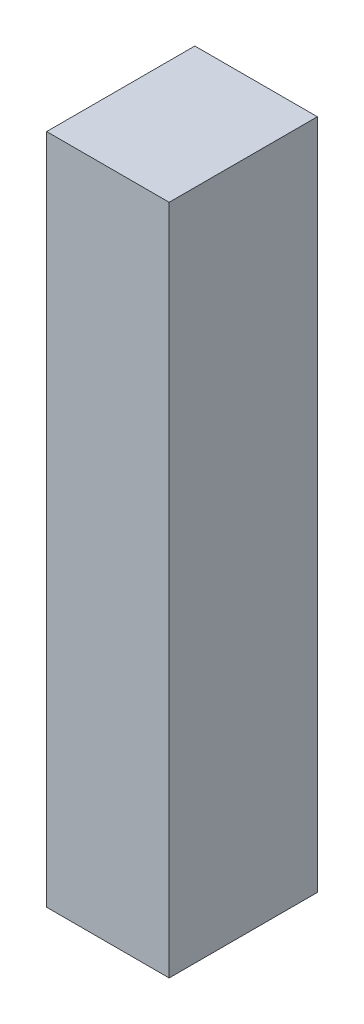
ISO-10303-21;
HEADER;
FILE_DESCRIPTION(('STEP AP214'),'2;1');
FILE_NAME('part.step','',(''),(''),'','','');
FILE_SCHEMA(('AUTOMOTIVE_DESIGN { 1 0 10303 214 1 1 1 1 }'));
ENDSEC;
DATA;
#1=APPLICATION_CONTEXT('core data for automotive mechanical design processes');
#2=APPLICATION_PROTOCOL_DEFINITION('international standard','automotive_design',2000,#1);
#3=PRODUCT_CONTEXT('',#1,'mechanical');
#4=PRODUCT('Part','Part','',(#3));
#5=PRODUCT_RELATED_PRODUCT_CATEGORY('part','',(#4));
#6=PRODUCT_DEFINITION_FORMATION('','',#4);
#7=PRODUCT_DEFINITION_CONTEXT('part definition',#1,'design');
#8=PRODUCT_DEFINITION('design','',#6,#7);
#9=PRODUCT_DEFINITION_SHAPE('','',#8);
#10=(LENGTH_UNIT() NAMED_UNIT(*) SI_UNIT(.MILLI.,.METRE.));
#11=(NAMED_UNIT(*) PLANE_ANGLE_UNIT() SI_UNIT($,.RADIAN.));
#12=(NAMED_UNIT(*) SI_UNIT($,.STERADIAN.) SOLID_ANGLE_UNIT());
#13=UNCERTAINTY_MEASURE_WITH_UNIT(LENGTH_MEASURE(1.E-05),#10,'distance_accuracy_value','');
#14=(GEOMETRIC_REPRESENTATION_CONTEXT(3) GLOBAL_UNCERTAINTY_ASSIGNED_CONTEXT((#13)) GLOBAL_UNIT_ASSIGNED_CONTEXT((#10,
#11,#12)) REPRESENTATION_CONTEXT('',''));
#15=CARTESIAN_POINT('',(0.,0.,0.));
#16=DIRECTION('',(0.,0.,1.));
#17=DIRECTION('',(1.,0.,0.));
#18=AXIS2_PLACEMENT_3D('',#15,#16,#17);
#19=CARTESIAN_POINT('',(-0.30999938,-1.69999914,0.75000104));
#20=DIRECTION('',(0.,0.,1.));
#21=DIRECTION('',(1.,0.,0.));
#22=AXIS2_PLACEMENT_3D('',#19,#20,#21);
#23=PLANE('',#22);
#24=DIRECTION('',(-1.,0.,0.));
#25=VECTOR('',#24,1.);
#26=CARTESIAN_POINT('',(0.31000192,-1.69999914,0.75000104));
#27=LINE('',#26,#25);
#28=CARTESIAN_POINT('',(0.31000192,-1.69999914,0.75000104));
#29=VERTEX_POINT('',#28);
#30=CARTESIAN_POINT('',(-0.30999938,-1.69999914,0.75000104));
#31=VERTEX_POINT('',#30);
#32=EDGE_CURVE('E26',#29,#31,#27,.T.);
#33=ORIENTED_EDGE('',*,*,#32,.F.);
#34=DIRECTION('',(0.,-1.,0.));
#35=VECTOR('',#34,1.);
#36=CARTESIAN_POINT('',(0.31000192,1.69999914,0.75000104));
#37=LINE('',#36,#35);
#38=CARTESIAN_POINT('',(0.31000192,1.69999914,0.75000104));
#39=VERTEX_POINT('',#38);
#40=EDGE_CURVE('E75',#39,#29,#37,.T.);
#41=ORIENTED_EDGE('',*,*,#40,.F.);
#42=DIRECTION('',(1.,0.,0.));
#43=VECTOR('',#42,1.);
#44=CARTESIAN_POINT('',(-0.30999938,1.69999914,0.75000104));
#45=LINE('',#44,#43);
#46=CARTESIAN_POINT('',(-0.30999938,1.69999914,0.75000104));
#47=VERTEX_POINT('',#46);
#48=EDGE_CURVE('E69',#47,#39,#45,.T.);
#49=ORIENTED_EDGE('',*,*,#48,.F.);
#50=DIRECTION('',(0.,1.,0.));
#51=VECTOR('',#50,1.);
#52=CARTESIAN_POINT('',(-0.30999938,-1.69999914,0.75000104));
#53=LINE('',#52,#51);
#54=EDGE_CURVE('E72',#31,#47,#53,.T.);
#55=ORIENTED_EDGE('',*,*,#54,.F.);
#56=EDGE_LOOP('',(#33,#41,#49,#55));
#57=FACE_BOUND('',#56,.T.);
#58=ADVANCED_FACE('F16',(#57),#23,.T.);
#59=CARTESIAN_POINT('',(-0.30999938,-1.69999914,0.));
#60=DIRECTION('',(0.,0.,1.));
#61=DIRECTION('',(1.,0.,0.));
#62=AXIS2_PLACEMENT_3D('',#59,#60,#61);
#63=PLANE('',#62);
#64=DIRECTION('',(0.,1.,0.));
#65=VECTOR('',#64,1.);
#66=CARTESIAN_POINT('',(-0.30999938,-1.69999914,0.));
#67=LINE('',#66,#65);
#68=CARTESIAN_POINT('',(-0.30999938,-1.69999914,0.));
#69=VERTEX_POINT('',#68);
#70=CARTESIAN_POINT('',(-0.30999938,1.69999914,0.));
#71=VERTEX_POINT('',#70);
#72=EDGE_CURVE('E81',#69,#71,#67,.T.);
#73=ORIENTED_EDGE('',*,*,#72,.T.);
#74=DIRECTION('',(1.,0.,0.));
#75=VECTOR('',#74,1.);
#76=CARTESIAN_POINT('',(-0.30999938,1.69999914,0.));
#77=LINE('',#76,#75);
#78=CARTESIAN_POINT('',(0.31000192,1.69999914,0.));
#79=VERTEX_POINT('',#78);
#80=EDGE_CURVE('E20',#71,#79,#77,.T.);
#81=ORIENTED_EDGE('',*,*,#80,.T.);
#82=DIRECTION('',(0.,-1.,0.));
#83=VECTOR('',#82,1.);
#84=CARTESIAN_POINT('',(0.31000192,1.69999914,0.));
#85=LINE('',#84,#83);
#86=CARTESIAN_POINT('',(0.31000192,-1.69999914,0.));
#87=VERTEX_POINT('',#86);
#88=EDGE_CURVE('E108',#79,#87,#85,.T.);
#89=ORIENTED_EDGE('',*,*,#88,.T.);
#90=DIRECTION('',(-1.,0.,0.));
#91=VECTOR('',#90,1.);
#92=CARTESIAN_POINT('',(0.31000192,-1.69999914,0.));
#93=LINE('',#92,#91);
#94=EDGE_CURVE('E11',#87,#69,#93,.T.);
#95=ORIENTED_EDGE('',*,*,#94,.T.);
#96=EDGE_LOOP('',(#73,#81,#89,#95));
#97=FACE_BOUND('',#96,.T.);
#98=ADVANCED_FACE('F116',(#97),#63,.F.);
#99=CARTESIAN_POINT('',(0.31000192,-1.69999914,0.));
#100=DIRECTION('',(0.,-1.,0.));
#101=DIRECTION('',(0.,0.,-1.));
#102=AXIS2_PLACEMENT_3D('',#99,#100,#101);
#103=PLANE('',#102);
#104=DIRECTION('',(0.,0.,1.));
#105=VECTOR('',#104,1.);
#106=CARTESIAN_POINT('',(0.31000192,-1.69999914,0.));
#107=LINE('',#106,#105);
#108=EDGE_CURVE('E106',#87,#29,#107,.T.);
#109=ORIENTED_EDGE('',*,*,#108,.T.);
#110=ORIENTED_EDGE('',*,*,#32,.T.);
#111=DIRECTION('',(0.,0.,1.));
#112=VECTOR('',#111,1.);
#113=CARTESIAN_POINT('',(-0.30999938,-1.69999914,0.));
#114=LINE('',#113,#112);
#115=EDGE_CURVE('E93',#69,#31,#114,.T.);
#116=ORIENTED_EDGE('',*,*,#115,.F.);
#117=ORIENTED_EDGE('',*,*,#94,.F.);
#118=EDGE_LOOP('',(#109,#110,#116,#117));
#119=FACE_BOUND('',#118,.T.);
#120=ADVANCED_FACE('F18',(#119),#103,.T.);
#121=CARTESIAN_POINT('',(0.31000192,1.69999914,0.));
#122=DIRECTION('',(1.,0.,0.));
#123=DIRECTION('',(0.,1.,0.));
#124=AXIS2_PLACEMENT_3D('',#121,#122,#123);
#125=PLANE('',#124);
#126=DIRECTION('',(0.,0.,1.));
#127=VECTOR('',#126,1.);
#128=CARTESIAN_POINT('',(0.31000192,1.69999914,0.));
#129=LINE('',#128,#127);
#130=EDGE_CURVE('E80',#79,#39,#129,.T.);
#131=ORIENTED_EDGE('',*,*,#130,.T.);
#132=ORIENTED_EDGE('',*,*,#40,.T.);
#133=ORIENTED_EDGE('',*,*,#108,.F.);
#134=ORIENTED_EDGE('',*,*,#88,.F.);
#135=EDGE_LOOP('',(#131,#132,#133,#134));
#136=FACE_BOUND('',#135,.T.);
#137=ADVANCED_FACE('F152',(#136),#125,.T.);
#138=CARTESIAN_POINT('',(-0.30999938,1.69999914,0.));
#139=DIRECTION('',(0.,1.,0.));
#140=DIRECTION('',(1.,0.,0.));
#141=AXIS2_PLACEMENT_3D('',#138,#139,#140);
#142=PLANE('',#141);
#143=DIRECTION('',(0.,0.,1.));
#144=VECTOR('',#143,1.);
#145=CARTESIAN_POINT('',(-0.30999938,1.69999914,0.));
#146=LINE('',#145,#144);
#147=EDGE_CURVE('E84',#71,#47,#146,.T.);
#148=ORIENTED_EDGE('',*,*,#147,.T.);
#149=ORIENTED_EDGE('',*,*,#48,.T.);
#150=ORIENTED_EDGE('',*,*,#130,.F.);
#151=ORIENTED_EDGE('',*,*,#80,.F.);
#152=EDGE_LOOP('',(#148,#149,#150,#151));
#153=FACE_BOUND('',#152,.T.);
#154=ADVANCED_FACE('F85',(#153),#142,.T.);
#155=CARTESIAN_POINT('',(-0.30999938,-1.69999914,0.));
#156=DIRECTION('',(-1.,0.,0.));
#157=DIRECTION('',(0.,0.,1.));
#158=AXIS2_PLACEMENT_3D('',#155,#156,#157);
#159=PLANE('',#158);
#160=ORIENTED_EDGE('',*,*,#115,.T.);
#161=ORIENTED_EDGE('',*,*,#54,.T.);
#162=ORIENTED_EDGE('',*,*,#147,.F.);
#163=ORIENTED_EDGE('',*,*,#72,.F.);
#164=EDGE_LOOP('',(#160,#161,#162,#163));
#165=FACE_BOUND('',#164,.T.);
#166=ADVANCED_FACE('F92',(#165),#159,.T.);
#167=CLOSED_SHELL('',(#58,#98,#120,#137,#154,#166));
#168=MANIFOLD_SOLID_BREP('B1',#167);
#169=ADVANCED_BREP_SHAPE_REPRESENTATION('',(#18,#168),#14);
#170=SHAPE_DEFINITION_REPRESENTATION(#9,#169);
ENDSEC;
END-ISO-10303-21;
